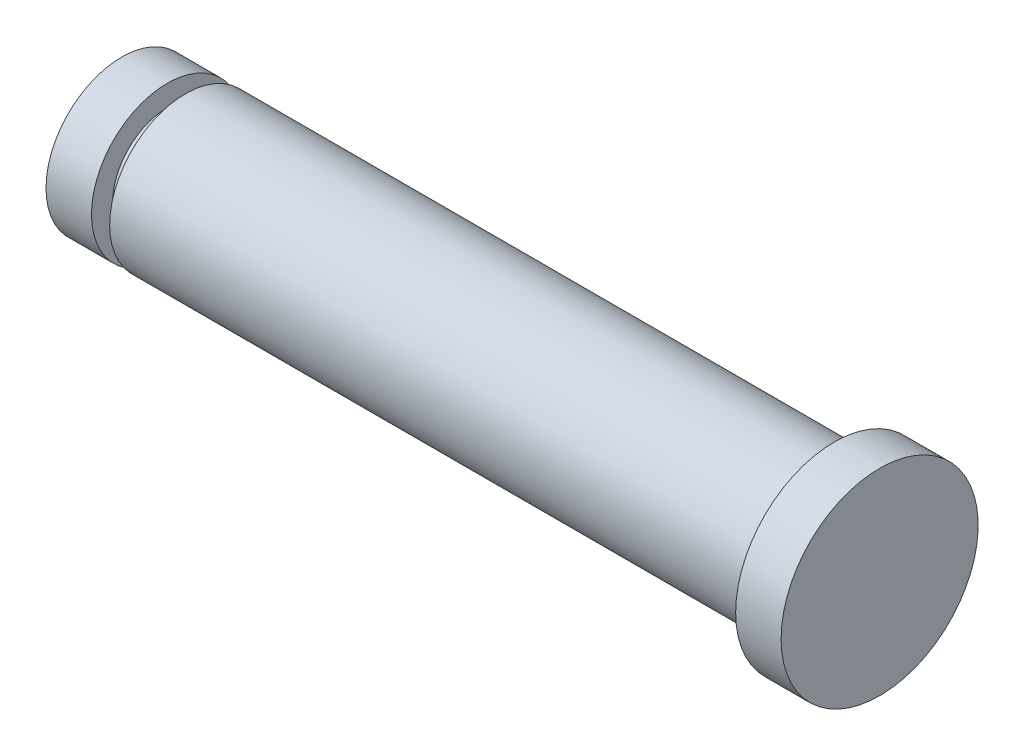
ISO-10303-21;
HEADER;
FILE_DESCRIPTION(('STEP AP214'),'2;1');
FILE_NAME('part.step','',(''),(''),'','','');
FILE_SCHEMA(('AUTOMOTIVE_DESIGN { 1 0 10303 214 1 1 1 1 }'));
ENDSEC;
DATA;
#1=APPLICATION_CONTEXT('core data for automotive mechanical design processes');
#2=APPLICATION_PROTOCOL_DEFINITION('international standard','automotive_design',2000,#1);
#3=PRODUCT_CONTEXT('',#1,'mechanical');
#4=PRODUCT('Part','Part','',(#3));
#5=PRODUCT_RELATED_PRODUCT_CATEGORY('part','',(#4));
#6=PRODUCT_DEFINITION_FORMATION('','',#4);
#7=PRODUCT_DEFINITION_CONTEXT('part definition',#1,'design');
#8=PRODUCT_DEFINITION('design','',#6,#7);
#9=PRODUCT_DEFINITION_SHAPE('','',#8);
#10=(LENGTH_UNIT() NAMED_UNIT(*) SI_UNIT(.MILLI.,.METRE.));
#11=(NAMED_UNIT(*) PLANE_ANGLE_UNIT() SI_UNIT($,.RADIAN.));
#12=(NAMED_UNIT(*) SI_UNIT($,.STERADIAN.) SOLID_ANGLE_UNIT());
#13=UNCERTAINTY_MEASURE_WITH_UNIT(LENGTH_MEASURE(1.E-05),#10,'distance_accuracy_value','');
#14=(GEOMETRIC_REPRESENTATION_CONTEXT(3) GLOBAL_UNCERTAINTY_ASSIGNED_CONTEXT((#13)) GLOBAL_UNIT_ASSIGNED_CONTEXT((#10,
#11,#12)) REPRESENTATION_CONTEXT('',''));
#15=CARTESIAN_POINT('',(0.,0.,0.));
#16=DIRECTION('',(0.,0.,1.));
#17=DIRECTION('',(1.,0.,0.));
#18=AXIS2_PLACEMENT_3D('',#15,#16,#17);
#19=CARTESIAN_POINT('',(0.,25.,0.));
#20=DIRECTION('',(1.,0.,0.));
#21=DIRECTION('',(0.,0.,-1.));
#22=AXIS2_PLACEMENT_3D('',#19,#20,#21);
#23=PLANE('',#22);
#24=CARTESIAN_POINT('',(0.,0.,0.));
#25=DIRECTION('',(-1.,0.,0.));
#26=DIRECTION('',(0.,0.,1.));
#27=AXIS2_PLACEMENT_3D('',#24,#25,#26);
#28=CIRCLE('',#27,25.);
#29=CARTESIAN_POINT('',(0.,0.,25.));
#30=VERTEX_POINT('',#29);
#31=EDGE_CURVE('E56',#30,#30,#28,.T.);
#32=ORIENTED_EDGE('',*,*,#31,.T.);
#33=EDGE_LOOP('',(#32));
#34=FACE_BOUND('',#33,.T.);
#35=ADVANCED_FACE('F28',(#34),#23,.F.);
#36=CARTESIAN_POINT('',(250.,32.5,0.));
#37=DIRECTION('',(-1.,0.,0.));
#38=DIRECTION('',(0.,0.,1.));
#39=AXIS2_PLACEMENT_3D('',#36,#37,#38);
#40=PLANE('',#39);
#41=CARTESIAN_POINT('',(250.,0.,0.));
#42=DIRECTION('',(-1.,0.,0.));
#43=DIRECTION('',(0.,0.,1.));
#44=AXIS2_PLACEMENT_3D('',#41,#42,#43);
#45=CIRCLE('',#44,32.5);
#46=CARTESIAN_POINT('',(250.,0.,32.5));
#47=VERTEX_POINT('',#46);
#48=EDGE_CURVE('E10',#47,#47,#45,.T.);
#49=ORIENTED_EDGE('',*,*,#48,.F.);
#50=EDGE_LOOP('',(#49));
#51=FACE_BOUND('',#50,.T.);
#52=ADVANCED_FACE('F98',(#51),#40,.F.);
#53=CARTESIAN_POINT('',(0.,0.,0.));
#54=DIRECTION('',(-1.,0.,0.));
#55=DIRECTION('',(0.,0.,1.));
#56=AXIS2_PLACEMENT_3D('',#53,#54,#55);
#57=CYLINDRICAL_SURFACE('',#56,32.5);
#58=CARTESIAN_POINT('',(235.,0.,0.));
#59=DIRECTION('',(-1.,0.,0.));
#60=DIRECTION('',(0.,0.,1.));
#61=AXIS2_PLACEMENT_3D('',#58,#59,#60);
#62=CIRCLE('',#61,32.5);
#63=CARTESIAN_POINT('',(235.,0.,32.5));
#64=VERTEX_POINT('',#63);
#65=EDGE_CURVE('E34',#64,#64,#62,.T.);
#66=ORIENTED_EDGE('',*,*,#65,.F.);
#67=EDGE_LOOP('',(#66));
#68=FACE_BOUND('',#67,.T.);
#69=ORIENTED_EDGE('',*,*,#48,.T.);
#70=EDGE_LOOP('',(#69));
#71=FACE_BOUND('',#70,.T.);
#72=ADVANCED_FACE('F93',(#68,#71),#57,.T.);
#73=CARTESIAN_POINT('',(235.,25.,0.));
#74=DIRECTION('',(1.,0.,0.));
#75=DIRECTION('',(0.,0.,-1.));
#76=AXIS2_PLACEMENT_3D('',#73,#74,#75);
#77=PLANE('',#76);
#78=CARTESIAN_POINT('',(235.,0.,0.));
#79=DIRECTION('',(-1.,0.,0.));
#80=DIRECTION('',(0.,0.,1.));
#81=AXIS2_PLACEMENT_3D('',#78,#79,#80);
#82=CIRCLE('',#81,25.);
#83=CARTESIAN_POINT('',(235.,0.,25.));
#84=VERTEX_POINT('',#83);
#85=EDGE_CURVE('E38',#84,#84,#82,.T.);
#86=ORIENTED_EDGE('',*,*,#85,.F.);
#87=EDGE_LOOP('',(#86));
#88=FACE_BOUND('',#87,.T.);
#89=ORIENTED_EDGE('',*,*,#65,.T.);
#90=EDGE_LOOP('',(#89));
#91=FACE_BOUND('',#90,.T.);
#92=ADVANCED_FACE('F88',(#88,#91),#77,.F.);
#93=CARTESIAN_POINT('',(0.,0.,0.));
#94=DIRECTION('',(-1.,0.,0.));
#95=DIRECTION('',(0.,0.,1.));
#96=AXIS2_PLACEMENT_3D('',#93,#94,#95);
#97=CYLINDRICAL_SURFACE('',#96,25.);
#98=CARTESIAN_POINT('',(21.,0.,0.));
#99=DIRECTION('',(-1.,0.,0.));
#100=DIRECTION('',(0.,0.,1.));
#101=AXIS2_PLACEMENT_3D('',#98,#99,#100);
#102=CIRCLE('',#101,25.);
#103=CARTESIAN_POINT('',(21.,0.,25.));
#104=VERTEX_POINT('',#103);
#105=EDGE_CURVE('E42',#104,#104,#102,.T.);
#106=ORIENTED_EDGE('',*,*,#105,.F.);
#107=EDGE_LOOP('',(#106));
#108=FACE_BOUND('',#107,.T.);
#109=ORIENTED_EDGE('',*,*,#85,.T.);
#110=EDGE_LOOP('',(#109));
#111=FACE_BOUND('',#110,.T.);
#112=ADVANCED_FACE('F82',(#108,#111),#97,.T.);
#113=CARTESIAN_POINT('',(21.,25.,0.));
#114=DIRECTION('',(1.,0.,0.));
#115=DIRECTION('',(0.,0.,-1.));
#116=AXIS2_PLACEMENT_3D('',#113,#114,#115);
#117=PLANE('',#116);
#118=CARTESIAN_POINT('',(21.,0.,0.));
#119=DIRECTION('',(-1.,0.,0.));
#120=DIRECTION('',(0.,0.,1.));
#121=AXIS2_PLACEMENT_3D('',#118,#119,#120);
#122=CIRCLE('',#121,18.);
#123=CARTESIAN_POINT('',(21.,0.,18.));
#124=VERTEX_POINT('',#123);
#125=EDGE_CURVE('E47',#124,#124,#122,.T.);
#126=ORIENTED_EDGE('',*,*,#125,.F.);
#127=EDGE_LOOP('',(#126));
#128=FACE_BOUND('',#127,.T.);
#129=ORIENTED_EDGE('',*,*,#105,.T.);
#130=EDGE_LOOP('',(#129));
#131=FACE_BOUND('',#130,.T.);
#132=ADVANCED_FACE('F76',(#128,#131),#117,.F.);
#133=CARTESIAN_POINT('',(0.,0.,0.));
#134=DIRECTION('',(-1.,0.,0.));
#135=DIRECTION('',(0.,0.,1.));
#136=AXIS2_PLACEMENT_3D('',#133,#134,#135);
#137=CYLINDRICAL_SURFACE('',#136,18.);
#138=CARTESIAN_POINT('',(15.,0.,0.));
#139=DIRECTION('',(-1.,0.,0.));
#140=DIRECTION('',(0.,0.,1.));
#141=AXIS2_PLACEMENT_3D('',#138,#139,#140);
#142=CIRCLE('',#141,18.);
#143=CARTESIAN_POINT('',(15.,0.,18.));
#144=VERTEX_POINT('',#143);
#145=EDGE_CURVE('E50',#144,#144,#142,.T.);
#146=ORIENTED_EDGE('',*,*,#145,.F.);
#147=EDGE_LOOP('',(#146));
#148=FACE_BOUND('',#147,.T.);
#149=ORIENTED_EDGE('',*,*,#125,.T.);
#150=EDGE_LOOP('',(#149));
#151=FACE_BOUND('',#150,.T.);
#152=ADVANCED_FACE('F70',(#148,#151),#137,.T.);
#153=CARTESIAN_POINT('',(15.,18.,0.));
#154=DIRECTION('',(-1.,0.,0.));
#155=DIRECTION('',(0.,0.,1.));
#156=AXIS2_PLACEMENT_3D('',#153,#154,#155);
#157=PLANE('',#156);
#158=CARTESIAN_POINT('',(15.,0.,0.));
#159=DIRECTION('',(-1.,0.,0.));
#160=DIRECTION('',(0.,0.,1.));
#161=AXIS2_PLACEMENT_3D('',#158,#159,#160);
#162=CIRCLE('',#161,25.);
#163=CARTESIAN_POINT('',(15.,0.,25.));
#164=VERTEX_POINT('',#163);
#165=EDGE_CURVE('E53',#164,#164,#162,.T.);
#166=ORIENTED_EDGE('',*,*,#165,.F.);
#167=EDGE_LOOP('',(#166));
#168=FACE_BOUND('',#167,.T.);
#169=ORIENTED_EDGE('',*,*,#145,.T.);
#170=EDGE_LOOP('',(#169));
#171=FACE_BOUND('',#170,.T.);
#172=ADVANCED_FACE('F64',(#168,#171),#157,.F.);
#173=CARTESIAN_POINT('',(0.,0.,0.));
#174=DIRECTION('',(-1.,0.,0.));
#175=DIRECTION('',(0.,0.,1.));
#176=AXIS2_PLACEMENT_3D('',#173,#174,#175);
#177=CYLINDRICAL_SURFACE('',#176,25.);
#178=ORIENTED_EDGE('',*,*,#31,.F.);
#179=EDGE_LOOP('',(#178));
#180=FACE_BOUND('',#179,.T.);
#181=ORIENTED_EDGE('',*,*,#165,.T.);
#182=EDGE_LOOP('',(#181));
#183=FACE_BOUND('',#182,.T.);
#184=ADVANCED_FACE('F61',(#180,#183),#177,.T.);
#185=CLOSED_SHELL('',(#35,#52,#72,#92,#112,#132,#152,#172,#184));
#186=MANIFOLD_SOLID_BREP('B2',#185);
#187=ADVANCED_BREP_SHAPE_REPRESENTATION('',(#18,#186),#14);
#188=SHAPE_DEFINITION_REPRESENTATION(#9,#187);
ENDSEC;
END-ISO-10303-21;
